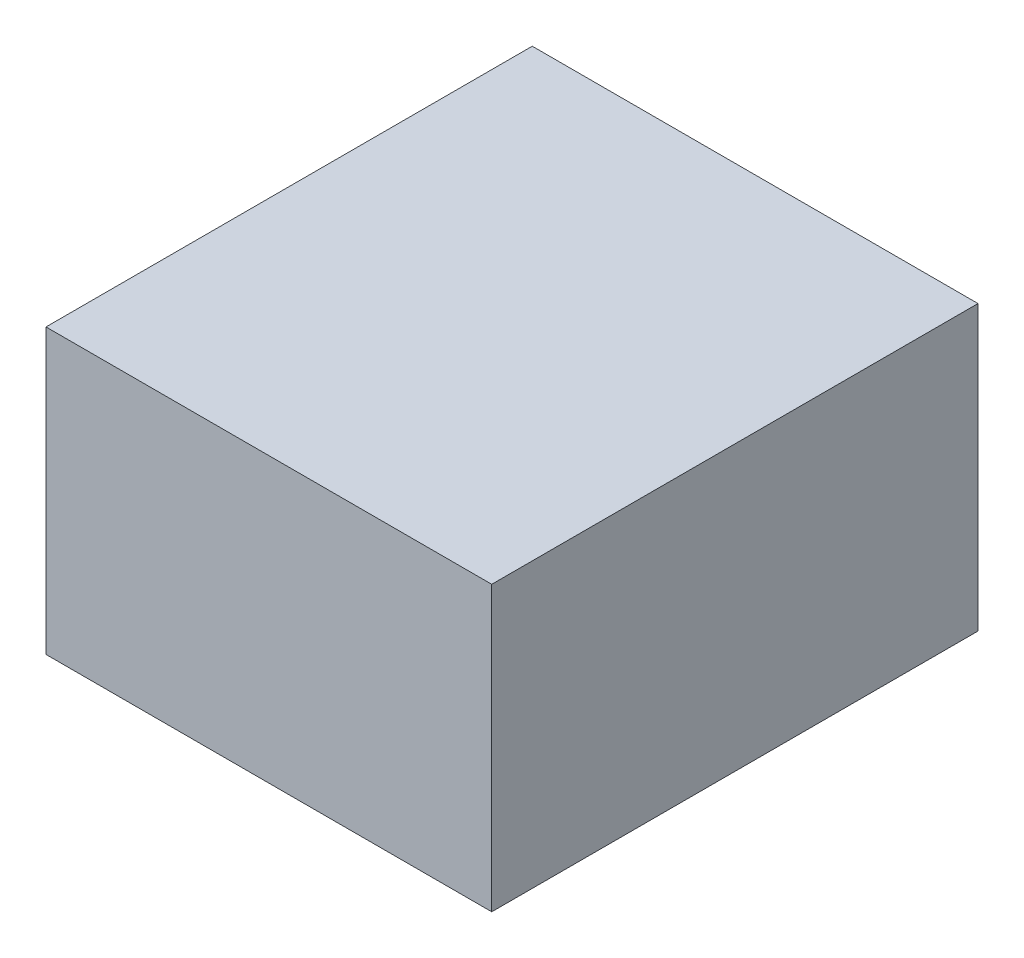
ISO-10303-21;
HEADER;
FILE_DESCRIPTION(('STEP AP214'),'2;1');
FILE_NAME('part.step','',(''),(''),'','','');
FILE_SCHEMA(('AUTOMOTIVE_DESIGN { 1 0 10303 214 1 1 1 1 }'));
ENDSEC;
DATA;
#1=APPLICATION_CONTEXT('core data for automotive mechanical design processes');
#2=APPLICATION_PROTOCOL_DEFINITION('international standard','automotive_design',2000,#1);
#3=PRODUCT_CONTEXT('',#1,'mechanical');
#4=PRODUCT('Part','Part','',(#3));
#5=PRODUCT_RELATED_PRODUCT_CATEGORY('part','',(#4));
#6=PRODUCT_DEFINITION_FORMATION('','',#4);
#7=PRODUCT_DEFINITION_CONTEXT('part definition',#1,'design');
#8=PRODUCT_DEFINITION('design','',#6,#7);
#9=PRODUCT_DEFINITION_SHAPE('','',#8);
#10=(LENGTH_UNIT() NAMED_UNIT(*) SI_UNIT(.MILLI.,.METRE.));
#11=(NAMED_UNIT(*) PLANE_ANGLE_UNIT() SI_UNIT($,.RADIAN.));
#12=(NAMED_UNIT(*) SI_UNIT($,.STERADIAN.) SOLID_ANGLE_UNIT());
#13=UNCERTAINTY_MEASURE_WITH_UNIT(LENGTH_MEASURE(1.E-05),#10,'distance_accuracy_value','');
#14=(GEOMETRIC_REPRESENTATION_CONTEXT(3) GLOBAL_UNCERTAINTY_ASSIGNED_CONTEXT((#13)) GLOBAL_UNIT_ASSIGNED_CONTEXT((#10,
#11,#12)) REPRESENTATION_CONTEXT('',''));
#15=CARTESIAN_POINT('',(0.,0.,0.));
#16=DIRECTION('',(0.,0.,1.));
#17=DIRECTION('',(1.,0.,0.));
#18=AXIS2_PLACEMENT_3D('',#15,#16,#17);
#19=CARTESIAN_POINT('',(-139.7,-88.9,304.8));
#20=DIRECTION('',(1.,0.,0.));
#21=DIRECTION('',(0.,0.,-1.));
#22=AXIS2_PLACEMENT_3D('',#19,#20,#21);
#23=PLANE('',#22);
#24=DIRECTION('',(0.,-1.,0.));
#25=VECTOR('',#24,1.);
#26=CARTESIAN_POINT('',(-139.7,-88.9,0.));
#27=LINE('',#26,#25);
#28=CARTESIAN_POINT('',(-139.7,88.9,0.));
#29=VERTEX_POINT('',#28);
#30=CARTESIAN_POINT('',(-139.7,-88.9,0.));
#31=VERTEX_POINT('',#30);
#32=EDGE_CURVE('E117',#29,#31,#27,.T.);
#33=ORIENTED_EDGE('',*,*,#32,.T.);
#34=DIRECTION('',(0.,0.,-1.));
#35=VECTOR('',#34,1.);
#36=CARTESIAN_POINT('',(-139.7,-88.9,304.8));
#37=LINE('',#36,#35);
#38=CARTESIAN_POINT('',(-139.7,-88.9,304.8));
#39=VERTEX_POINT('',#38);
#40=EDGE_CURVE('E11',#39,#31,#37,.T.);
#41=ORIENTED_EDGE('',*,*,#40,.F.);
#42=DIRECTION('',(0.,-1.,0.));
#43=VECTOR('',#42,1.);
#44=CARTESIAN_POINT('',(-139.7,-88.9,304.8));
#45=LINE('',#44,#43);
#46=CARTESIAN_POINT('',(-139.7,88.9,304.8));
#47=VERTEX_POINT('',#46);
#48=EDGE_CURVE('E101',#47,#39,#45,.T.);
#49=ORIENTED_EDGE('',*,*,#48,.F.);
#50=DIRECTION('',(0.,0.,-1.));
#51=VECTOR('',#50,1.);
#52=CARTESIAN_POINT('',(-139.7,88.9,304.8));
#53=LINE('',#52,#51);
#54=EDGE_CURVE('E113',#47,#29,#53,.T.);
#55=ORIENTED_EDGE('',*,*,#54,.T.);
#56=EDGE_LOOP('',(#33,#41,#49,#55));
#57=FACE_BOUND('',#56,.T.);
#58=ADVANCED_FACE('F49',(#57),#23,.F.);
#59=CARTESIAN_POINT('',(139.7,-88.9,304.8));
#60=DIRECTION('',(0.,1.,0.));
#61=DIRECTION('',(-1.,0.,0.));
#62=AXIS2_PLACEMENT_3D('',#59,#60,#61);
#63=PLANE('',#62);
#64=DIRECTION('',(1.,0.,0.));
#65=VECTOR('',#64,1.);
#66=CARTESIAN_POINT('',(139.7,-88.9,0.));
#67=LINE('',#66,#65);
#68=CARTESIAN_POINT('',(139.7,-88.9,0.));
#69=VERTEX_POINT('',#68);
#70=EDGE_CURVE('E106',#31,#69,#67,.T.);
#71=ORIENTED_EDGE('',*,*,#70,.T.);
#72=DIRECTION('',(0.,0.,-1.));
#73=VECTOR('',#72,1.);
#74=CARTESIAN_POINT('',(139.7,-88.9,304.8));
#75=LINE('',#74,#73);
#76=CARTESIAN_POINT('',(139.7,-88.9,304.8));
#77=VERTEX_POINT('',#76);
#78=EDGE_CURVE('E58',#77,#69,#75,.T.);
#79=ORIENTED_EDGE('',*,*,#78,.F.);
#80=DIRECTION('',(1.,0.,0.));
#81=VECTOR('',#80,1.);
#82=CARTESIAN_POINT('',(139.7,-88.9,304.8));
#83=LINE('',#82,#81);
#84=EDGE_CURVE('E96',#39,#77,#83,.T.);
#85=ORIENTED_EDGE('',*,*,#84,.F.);
#86=ORIENTED_EDGE('',*,*,#40,.T.);
#87=EDGE_LOOP('',(#71,#79,#85,#86));
#88=FACE_BOUND('',#87,.T.);
#89=ADVANCED_FACE('F105',(#88),#63,.F.);
#90=CARTESIAN_POINT('',(139.7,-88.9,304.8));
#91=DIRECTION('',(-1.,0.,0.));
#92=DIRECTION('',(0.,0.,1.));
#93=AXIS2_PLACEMENT_3D('',#90,#91,#92);
#94=PLANE('',#93);
#95=DIRECTION('',(0.,1.,0.));
#96=VECTOR('',#95,1.);
#97=CARTESIAN_POINT('',(139.7,-88.9,0.));
#98=LINE('',#97,#96);
#99=CARTESIAN_POINT('',(139.7,88.9,0.));
#100=VERTEX_POINT('',#99);
#101=EDGE_CURVE('E83',#69,#100,#98,.T.);
#102=ORIENTED_EDGE('',*,*,#101,.T.);
#103=DIRECTION('',(0.,0.,-1.));
#104=VECTOR('',#103,1.);
#105=CARTESIAN_POINT('',(139.7,88.9,304.8));
#106=LINE('',#105,#104);
#107=CARTESIAN_POINT('',(139.7,88.9,304.8));
#108=VERTEX_POINT('',#107);
#109=EDGE_CURVE('E108',#108,#100,#106,.T.);
#110=ORIENTED_EDGE('',*,*,#109,.F.);
#111=DIRECTION('',(0.,1.,0.));
#112=VECTOR('',#111,1.);
#113=CARTESIAN_POINT('',(139.7,-88.9,304.8));
#114=LINE('',#113,#112);
#115=EDGE_CURVE('E99',#77,#108,#114,.T.);
#116=ORIENTED_EDGE('',*,*,#115,.F.);
#117=ORIENTED_EDGE('',*,*,#78,.T.);
#118=EDGE_LOOP('',(#102,#110,#116,#117));
#119=FACE_BOUND('',#118,.T.);
#120=ADVANCED_FACE('F109',(#119),#94,.F.);
#121=CARTESIAN_POINT('',(139.7,88.9,304.8));
#122=DIRECTION('',(0.,-1.,0.));
#123=DIRECTION('',(1.,0.,0.));
#124=AXIS2_PLACEMENT_3D('',#121,#122,#123);
#125=PLANE('',#124);
#126=DIRECTION('',(-1.,0.,0.));
#127=VECTOR('',#126,1.);
#128=CARTESIAN_POINT('',(139.7,88.9,0.));
#129=LINE('',#128,#127);
#130=EDGE_CURVE('E89',#100,#29,#129,.T.);
#131=ORIENTED_EDGE('',*,*,#130,.T.);
#132=ORIENTED_EDGE('',*,*,#54,.F.);
#133=DIRECTION('',(-1.,0.,0.));
#134=VECTOR('',#133,1.);
#135=CARTESIAN_POINT('',(139.7,88.9,304.8));
#136=LINE('',#135,#134);
#137=EDGE_CURVE('E66',#108,#47,#136,.T.);
#138=ORIENTED_EDGE('',*,*,#137,.F.);
#139=ORIENTED_EDGE('',*,*,#109,.T.);
#140=EDGE_LOOP('',(#131,#132,#138,#139));
#141=FACE_BOUND('',#140,.T.);
#142=ADVANCED_FACE('F130',(#141),#125,.F.);
#143=CARTESIAN_POINT('',(0.,0.,304.8));
#144=DIRECTION('',(0.,0.,1.));
#145=DIRECTION('',(1.,0.,0.));
#146=AXIS2_PLACEMENT_3D('',#143,#144,#145);
#147=PLANE('',#146);
#148=ORIENTED_EDGE('',*,*,#48,.T.);
#149=ORIENTED_EDGE('',*,*,#84,.T.);
#150=ORIENTED_EDGE('',*,*,#115,.T.);
#151=ORIENTED_EDGE('',*,*,#137,.T.);
#152=EDGE_LOOP('',(#148,#149,#150,#151));
#153=FACE_BOUND('',#152,.T.);
#154=ADVANCED_FACE('F97',(#153),#147,.T.);
#155=CARTESIAN_POINT('',(0.,0.,0.));
#156=DIRECTION('',(0.,0.,1.));
#157=DIRECTION('',(1.,0.,0.));
#158=AXIS2_PLACEMENT_3D('',#155,#156,#157);
#159=PLANE('',#158);
#160=ORIENTED_EDGE('',*,*,#32,.F.);
#161=ORIENTED_EDGE('',*,*,#130,.F.);
#162=ORIENTED_EDGE('',*,*,#101,.F.);
#163=ORIENTED_EDGE('',*,*,#70,.F.);
#164=EDGE_LOOP('',(#160,#161,#162,#163));
#165=FACE_BOUND('',#164,.T.);
#166=ADVANCED_FACE('F133',(#165),#159,.F.);
#167=CLOSED_SHELL('',(#58,#89,#120,#142,#154,#166));
#168=MANIFOLD_SOLID_BREP('B2',#167);
#169=ADVANCED_BREP_SHAPE_REPRESENTATION('',(#18,#168),#14);
#170=SHAPE_DEFINITION_REPRESENTATION(#9,#169);
ENDSEC;
END-ISO-10303-21;
